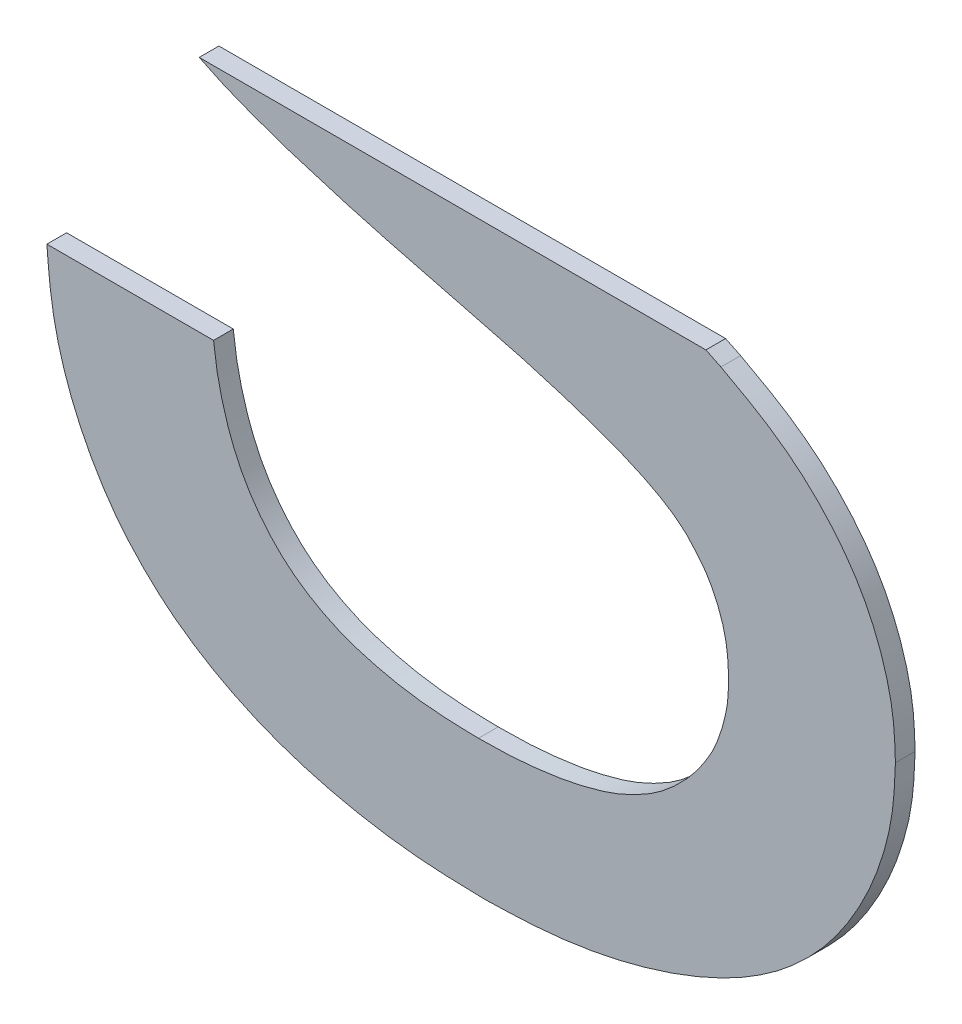
ISO-10303-21;
HEADER;
FILE_DESCRIPTION(('STEP AP214'),'2;1');
FILE_NAME('part.step','',(''),(''),'','','');
FILE_SCHEMA(('AUTOMOTIVE_DESIGN { 1 0 10303 214 1 1 1 1 }'));
ENDSEC;
DATA;
#1=APPLICATION_CONTEXT('core data for automotive mechanical design processes');
#2=APPLICATION_PROTOCOL_DEFINITION('international standard','automotive_design',2000,#1);
#3=PRODUCT_CONTEXT('',#1,'mechanical');
#4=PRODUCT('Part','Part','',(#3));
#5=PRODUCT_RELATED_PRODUCT_CATEGORY('part','',(#4));
#6=PRODUCT_DEFINITION_FORMATION('','',#4);
#7=PRODUCT_DEFINITION_CONTEXT('part definition',#1,'design');
#8=PRODUCT_DEFINITION('design','',#6,#7);
#9=PRODUCT_DEFINITION_SHAPE('','',#8);
#10=(LENGTH_UNIT() NAMED_UNIT(*) SI_UNIT(.MILLI.,.METRE.));
#11=(NAMED_UNIT(*) PLANE_ANGLE_UNIT() SI_UNIT($,.RADIAN.));
#12=(NAMED_UNIT(*) SI_UNIT($,.STERADIAN.) SOLID_ANGLE_UNIT());
#13=UNCERTAINTY_MEASURE_WITH_UNIT(LENGTH_MEASURE(1.E-05),#10,'distance_accuracy_value','');
#14=(GEOMETRIC_REPRESENTATION_CONTEXT(3) GLOBAL_UNCERTAINTY_ASSIGNED_CONTEXT((#13)) GLOBAL_UNIT_ASSIGNED_CONTEXT((#10,
#11,#12)) REPRESENTATION_CONTEXT('',''));
#15=CARTESIAN_POINT('',(0.,0.,0.));
#16=DIRECTION('',(0.,0.,1.));
#17=DIRECTION('',(1.,0.,0.));
#18=AXIS2_PLACEMENT_3D('',#15,#16,#17);
#19=CARTESIAN_POINT('',(5.46274038461435,-4.79567307692308,0.5));
#20=CARTESIAN_POINT('',(5.35855534775969,-4.70687353213871,0.5));
#21=CARTESIAN_POINT('',(5.12815657132435,-4.51049882148931,0.5));
#22=CARTESIAN_POINT('',(4.69946402907004,-4.25062026916394,0.5));
#23=CARTESIAN_POINT('',(4.16794938090392,-3.98804411029912,0.5));
#24=CARTESIAN_POINT('',(3.530058232044,-3.72703254015637,0.5));
#25=CARTESIAN_POINT('',(2.78690143860023,-3.46436404531144,0.5));
#26=CARTESIAN_POINT('',(1.93961750352461,-3.19411045590582,0.5));
#27=CARTESIAN_POINT('',(0.98337756459319,-2.92431205706373,0.5));
#28=CARTESIAN_POINT('',(-0.0501527574609852,-2.66853448428978,0.5));
#29=CARTESIAN_POINT('',(-1.09279838034203,-2.40591015089581,0.5));
#30=CARTESIAN_POINT('',(-2.08228100184151,-2.14713457683062,0.5));
#31=CARTESIAN_POINT('',(-2.99429833585646,-1.90530419286865,0.5));
#32=CARTESIAN_POINT('',(-3.81834933325007,-1.65353748972119,0.5));
#33=CARTESIAN_POINT('',(-4.56799356563629,-1.43270284207744,0.5));
#34=CARTESIAN_POINT('',(-5.22837105690996,-1.19953555628057,0.5));
#35=CARTESIAN_POINT('',(-5.81134590562884,-0.987938974377531,0.5));
#36=CARTESIAN_POINT('',(-6.16835592120979,-0.838584142741154,0.5));
#37=CARTESIAN_POINT('',(-6.33413461538565,-0.76923076923077,0.5));
#38=B_SPLINE_CURVE_WITH_KNOTS('',3,(#19,#20,#21,#22,#23,#24,#25,#26,#27,#28,#29,#30,#31,#32,#33,
#34,#35,#36,#37),.UNSPECIFIED.,.F.,.F.,(4,1,1,1,1,1,1,1,1,1,1,1,1,1,1,1,4),(0.,
0.0327434629435831,0.0724101466603221,0.119612379731133,0.174674220648575,0.237346864036756,
0.308354721371247,0.387632944786603,0.475252052982896,0.563336209685837,0.645140721901864,
0.720207592816174,0.78927483829459,0.851495963706113,0.907329911849841,0.956968360739976,1.),.UNSPECIFIED.);
#39=DIRECTION('',(0.,0.,1.));
#40=VECTOR('',#39,1.);
#41=SURFACE_OF_LINEAR_EXTRUSION('',#38,#40);
#42=CARTESIAN_POINT('',(5.46274038461435,-4.79567307692308,1.));
#43=CARTESIAN_POINT('',(5.35855534775969,-4.70687353213871,1.));
#44=CARTESIAN_POINT('',(5.12815657132435,-4.51049882148931,1.));
#45=CARTESIAN_POINT('',(4.69946402907004,-4.25062026916394,1.));
#46=CARTESIAN_POINT('',(4.16794938090392,-3.98804411029912,1.));
#47=CARTESIAN_POINT('',(3.530058232044,-3.72703254015637,1.));
#48=CARTESIAN_POINT('',(2.78690143860023,-3.46436404531144,1.));
#49=CARTESIAN_POINT('',(1.93961750352461,-3.19411045590582,1.));
#50=CARTESIAN_POINT('',(0.98337756459319,-2.92431205706373,1.));
#51=CARTESIAN_POINT('',(-0.0501527574609852,-2.66853448428978,1.));
#52=CARTESIAN_POINT('',(-1.09279838034203,-2.40591015089581,1.));
#53=CARTESIAN_POINT('',(-2.08228100184151,-2.14713457683062,1.));
#54=CARTESIAN_POINT('',(-2.99429833585646,-1.90530419286865,1.));
#55=CARTESIAN_POINT('',(-3.81834933325007,-1.65353748972119,1.));
#56=CARTESIAN_POINT('',(-4.56799356563629,-1.43270284207744,1.));
#57=CARTESIAN_POINT('',(-5.22837105690996,-1.19953555628057,1.));
#58=CARTESIAN_POINT('',(-5.81134590562884,-0.987938974377531,1.));
#59=CARTESIAN_POINT('',(-6.16835592120979,-0.838584142741154,1.));
#60=CARTESIAN_POINT('',(-6.33413461538565,-0.76923076923077,1.));
#61=B_SPLINE_CURVE_WITH_KNOTS('',3,(#42,#43,#44,#45,#46,#47,#48,#49,#50,#51,#52,#53,#54,#55,#56,
#57,#58,#59,#60),.UNSPECIFIED.,.F.,.F.,(4,1,1,1,1,1,1,1,1,1,1,1,1,1,1,1,4),(0.,
0.0327434629435831,0.0724101466603221,0.119612379731133,0.174674220648575,0.237346864036756,
0.308354721371247,0.387632944786603,0.475252052982896,0.563336209685837,0.645140721901864,
0.720207592816174,0.78927483829459,0.851495963706113,0.907329911849841,0.956968360739976,1.),.UNSPECIFIED.);
#62=CARTESIAN_POINT('',(5.46274038461435,-4.79567307692308,1.));
#63=VERTEX_POINT('',#62);
#64=CARTESIAN_POINT('',(-6.33413461538565,-0.76923076923077,1.));
#65=VERTEX_POINT('',#64);
#66=EDGE_CURVE('E102',#63,#65,#61,.T.);
#67=ORIENTED_EDGE('',*,*,#66,.T.);
#68=DIRECTION('',(0.,0.,1.));
#69=VECTOR('',#68,1.);
#70=CARTESIAN_POINT('',(-6.33413461538565,-0.76923076923077,0.5));
#71=LINE('',#70,#69);
#72=CARTESIAN_POINT('',(-6.33413461538565,-0.76923076923077,0.5));
#73=VERTEX_POINT('',#72);
#74=EDGE_CURVE('E319',#73,#65,#71,.T.);
#75=ORIENTED_EDGE('',*,*,#74,.F.);
#76=CARTESIAN_POINT('',(5.46274038461435,-4.79567307692308,0.5));
#77=VERTEX_POINT('',#76);
#78=EDGE_CURVE('E63',#77,#73,#38,.T.);
#79=ORIENTED_EDGE('',*,*,#78,.F.);
#80=DIRECTION('',(0.,0.,1.));
#81=VECTOR('',#80,1.);
#82=CARTESIAN_POINT('',(5.46274038461435,-4.79567307692308,0.5));
#83=LINE('',#82,#81);
#84=EDGE_CURVE('E150',#77,#63,#83,.T.);
#85=ORIENTED_EDGE('',*,*,#84,.T.);
#86=EDGE_LOOP('',(#67,#75,#79,#85));
#87=FACE_BOUND('',#86,.T.);
#88=ADVANCED_FACE('F39',(#87),#41,.F.);
#89=CARTESIAN_POINT('',(6.53846153846051,-7.44591346153846,0.5));
#90=CARTESIAN_POINT('',(6.52752823491745,-7.18780664806593,0.5));
#91=CARTESIAN_POINT('',(6.50630770082304,-6.68684512132103,0.5));
#92=CARTESIAN_POINT('',(6.28961502145924,-5.97512980245527,0.5));
#93=CARTESIAN_POINT('',(5.95634016450596,-5.32635517481283,0.5));
#94=CARTESIAN_POINT('',(5.62801132865093,-4.97336021308997,0.5));
#95=CARTESIAN_POINT('',(5.46274038461435,-4.79567307692308,0.5));
#96=B_SPLINE_CURVE_WITH_KNOTS('',3,(#89,#90,#91,#92,#93,#94,#95),.UNSPECIFIED.,.F.,.F.,(4,1,1,1,
4),(0.,0.262741230528268,0.509956502943233,0.75332671842045,1.),.UNSPECIFIED.);
#97=DIRECTION('',(0.,0.,1.));
#98=VECTOR('',#97,1.);
#99=SURFACE_OF_LINEAR_EXTRUSION('',#96,#98);
#100=CARTESIAN_POINT('',(6.53846153846051,-7.44591346153846,1.));
#101=CARTESIAN_POINT('',(6.52752823491745,-7.18780664806593,1.));
#102=CARTESIAN_POINT('',(6.50630770082304,-6.68684512132103,1.));
#103=CARTESIAN_POINT('',(6.28961502145924,-5.97512980245527,1.));
#104=CARTESIAN_POINT('',(5.95634016450596,-5.32635517481283,1.));
#105=CARTESIAN_POINT('',(5.62801132865093,-4.97336021308997,1.));
#106=CARTESIAN_POINT('',(5.46274038461435,-4.79567307692308,1.));
#107=B_SPLINE_CURVE_WITH_KNOTS('',3,(#100,#101,#102,#103,#104,#105,#106),.UNSPECIFIED.,.F.,.F.,
(4,1,1,1,4),(0.,0.262741230528268,0.509956502943233,0.75332671842045,1.),.UNSPECIFIED.);
#108=CARTESIAN_POINT('',(6.53846153846051,-7.44591346153846,1.));
#109=VERTEX_POINT('',#108);
#110=EDGE_CURVE('E298',#109,#63,#107,.T.);
#111=ORIENTED_EDGE('',*,*,#110,.T.);
#112=ORIENTED_EDGE('',*,*,#84,.F.);
#113=CARTESIAN_POINT('',(6.53846153846051,-7.44591346153846,0.5));
#114=VERTEX_POINT('',#113);
#115=EDGE_CURVE('E131',#114,#77,#96,.T.);
#116=ORIENTED_EDGE('',*,*,#115,.F.);
#117=DIRECTION('',(0.,0.,1.));
#118=VECTOR('',#117,1.);
#119=CARTESIAN_POINT('',(6.53846153846051,-7.44591346153846,0.5));
#120=LINE('',#119,#118);
#121=EDGE_CURVE('E139',#114,#109,#120,.T.);
#122=ORIENTED_EDGE('',*,*,#121,.T.);
#123=EDGE_LOOP('',(#111,#112,#116,#122));
#124=FACE_BOUND('',#123,.T.);
#125=ADVANCED_FACE('F146',(#124),#99,.F.);
#126=CARTESIAN_POINT('',(0.186298076922045,-11.9230769230769,0.5));
#127=CARTESIAN_POINT('',(0.452917518044397,-11.9210937635696,0.5));
#128=CARTESIAN_POINT('',(0.96902718427602,-11.9172548544973,0.5));
#129=CARTESIAN_POINT('',(1.71496689021582,-11.8459872335629,0.5));
#130=CARTESIAN_POINT('',(2.40691638472193,-11.7499167269663,0.5));
#131=CARTESIAN_POINT('',(3.04061013232792,-11.6024449932228,0.5));
#132=CARTESIAN_POINT('',(3.62196142670062,-11.4289410917482,0.5));
#133=CARTESIAN_POINT('',(4.14077313905586,-11.1959576905632,0.5));
#134=CARTESIAN_POINT('',(4.60941073522477,-10.9333231819877,0.5));
#135=CARTESIAN_POINT('',(5.01932751021528,-10.6254712040485,0.5));
#136=CARTESIAN_POINT('',(5.37264405381542,-10.2841727290803,0.5));
#137=CARTESIAN_POINT('',(5.68975027577586,-9.93358291449948,0.5));
#138=CARTESIAN_POINT('',(5.94543653971101,-9.55536049090254,0.5));
#139=CARTESIAN_POINT('',(6.1705814595386,-9.17044860815597,0.5));
#140=CARTESIAN_POINT('',(6.32745297205423,-8.75837554958169,0.5));
#141=CARTESIAN_POINT('',(6.45059355615463,-8.3370693226526,0.5));
#142=CARTESIAN_POINT('',(6.52546978829639,-7.89727149237541,0.5));
#143=CARTESIAN_POINT('',(6.53407111165592,-7.59844521222789,0.5));
#144=CARTESIAN_POINT('',(6.53846153846051,-7.44591346153846,0.5));
#145=B_SPLINE_CURVE_WITH_KNOTS('',3,(#126,#127,#128,#129,#130,#131,#132,#133,#134,#135,#136,
#137,#138,#139,#140,#141,#142,#143,#144),.UNSPECIFIED.,.F.,.F.,(4,1,1,1,1,1,1,1,1,1,1,1,1,1,1,1,
4),(0.,0.0915140484692245,0.177148691078688,0.257116948109752,0.331209300984302,
0.400397190524263,0.465074479187229,0.526080828418267,0.584552377371531,0.64050961155947,
0.694609394798849,0.7465128494333,0.797025553133285,0.847355247690185,0.89743516554621,
0.947647195719586,1.),.UNSPECIFIED.);
#146=DIRECTION('',(0.,0.,1.));
#147=VECTOR('',#146,1.);
#148=SURFACE_OF_LINEAR_EXTRUSION('',#145,#147);
#149=CARTESIAN_POINT('',(0.186298076922045,-11.9230769230769,1.));
#150=CARTESIAN_POINT('',(0.452917518044397,-11.9210937635696,1.));
#151=CARTESIAN_POINT('',(0.96902718427602,-11.9172548544973,1.));
#152=CARTESIAN_POINT('',(1.71496689021582,-11.8459872335629,1.));
#153=CARTESIAN_POINT('',(2.40691638472193,-11.7499167269663,1.));
#154=CARTESIAN_POINT('',(3.04061013232792,-11.6024449932228,1.));
#155=CARTESIAN_POINT('',(3.62196142670062,-11.4289410917482,1.));
#156=CARTESIAN_POINT('',(4.14077313905586,-11.1959576905632,1.));
#157=CARTESIAN_POINT('',(4.60941073522477,-10.9333231819877,1.));
#158=CARTESIAN_POINT('',(5.01932751021528,-10.6254712040485,1.));
#159=CARTESIAN_POINT('',(5.37264405381542,-10.2841727290803,1.));
#160=CARTESIAN_POINT('',(5.68975027577586,-9.93358291449948,1.));
#161=CARTESIAN_POINT('',(5.94543653971101,-9.55536049090254,1.));
#162=CARTESIAN_POINT('',(6.1705814595386,-9.17044860815597,1.));
#163=CARTESIAN_POINT('',(6.32745297205423,-8.75837554958169,1.));
#164=CARTESIAN_POINT('',(6.45059355615463,-8.3370693226526,1.));
#165=CARTESIAN_POINT('',(6.52546978829639,-7.89727149237541,1.));
#166=CARTESIAN_POINT('',(6.53407111165592,-7.59844521222789,1.));
#167=CARTESIAN_POINT('',(6.53846153846051,-7.44591346153846,1.));
#168=B_SPLINE_CURVE_WITH_KNOTS('',3,(#149,#150,#151,#152,#153,#154,#155,#156,#157,#158,#159,
#160,#161,#162,#163,#164,#165,#166,#167),.UNSPECIFIED.,.F.,.F.,(4,1,1,1,1,1,1,1,1,1,1,1,1,1,1,1,
4),(0.,0.0915140484692245,0.177148691078688,0.257116948109752,0.331209300984302,
0.400397190524263,0.465074479187229,0.526080828418267,0.584552377371531,0.64050961155947,
0.694609394798849,0.7465128494333,0.797025553133285,0.847355247690185,0.89743516554621,
0.947647195719586,1.),.UNSPECIFIED.);
#169=CARTESIAN_POINT('',(0.186298076922045,-11.9230769230769,1.));
#170=VERTEX_POINT('',#169);
#171=EDGE_CURVE('E142',#170,#109,#168,.T.);
#172=ORIENTED_EDGE('',*,*,#171,.T.);
#173=ORIENTED_EDGE('',*,*,#121,.F.);
#174=CARTESIAN_POINT('',(0.186298076922045,-11.9230769230769,0.5));
#175=VERTEX_POINT('',#174);
#176=EDGE_CURVE('E130',#175,#114,#145,.T.);
#177=ORIENTED_EDGE('',*,*,#176,.F.);
#178=DIRECTION('',(0.,0.,1.));
#179=VECTOR('',#178,1.);
#180=CARTESIAN_POINT('',(0.186298076922045,-11.9230769230769,0.5));
#181=LINE('',#180,#179);
#182=EDGE_CURVE('E147',#175,#170,#181,.T.);
#183=ORIENTED_EDGE('',*,*,#182,.T.);
#184=EDGE_LOOP('',(#172,#173,#177,#183));
#185=FACE_BOUND('',#184,.T.);
#186=ADVANCED_FACE('F141',(#185),#148,.F.);
#187=CARTESIAN_POINT('',(-6.53846153846257,-6.53846153846154,0.5));
#188=CARTESIAN_POINT('',(-6.51246258210713,-6.75349524100316,0.5));
#189=CARTESIAN_POINT('',(-6.46153800794992,-7.17468521423413,0.5));
#190=CARTESIAN_POINT('',(-6.3186754851747,-7.78000871491224,0.5));
#191=CARTESIAN_POINT('',(-6.14779119895138,-8.3485743947791,0.5));
#192=CARTESIAN_POINT('',(-5.93049214281791,-8.87399210906799,0.5));
#193=CARTESIAN_POINT('',(-5.67115183840622,-9.36090794848327,0.5));
#194=CARTESIAN_POINT('',(-5.36353125095178,-9.80376839325495,0.5));
#195=CARTESIAN_POINT('',(-5.01980561076393,-10.210955042207,0.5));
#196=CARTESIAN_POINT('',(-4.63168208872818,-10.5753219940976,0.5));
#197=CARTESIAN_POINT('',(-4.19548861918931,-10.8953113414413,0.5));
#198=CARTESIAN_POINT('',(-3.71113385038324,-11.1718621140596,0.5));
#199=CARTESIAN_POINT('',(-3.18041362236934,-11.4082303374483,0.5));
#200=CARTESIAN_POINT('',(-2.59817995810646,-11.5904515860155,0.5));
#201=CARTESIAN_POINT('',(-1.97221800331249,-11.7417718421085,0.5));
#202=CARTESIAN_POINT('',(-1.29532617326138,-11.8503932876669,0.5));
#203=CARTESIAN_POINT('',(-0.569870826836896,-11.9066618643388,0.5));
#204=CARTESIAN_POINT('',(-0.0701979570147258,-11.9175088582673,0.5));
#205=CARTESIAN_POINT('',(0.186298076922045,-11.9230769230769,0.5));
#206=B_SPLINE_CURVE_WITH_KNOTS('',3,(#187,#188,#189,#190,#191,#192,#193,#194,#195,#196,#197,
#198,#199,#200,#201,#202,#203,#204,#205),.UNSPECIFIED.,.F.,.F.,(4,1,1,1,1,1,1,1,1,1,1,1,1,1,1,1,
4),(0.,0.0671410498282914,0.131510254651379,0.192639446417471,0.251147769802786,
0.307586721038773,0.363434168034989,0.418097065205676,0.47261141200912,0.528167696051712,
0.585512769002848,0.645326514018987,0.708015056196522,0.774482698796732,0.844973721145099,
0.920420683043269,1.),.UNSPECIFIED.);
#207=DIRECTION('',(0.,0.,1.));
#208=VECTOR('',#207,1.);
#209=SURFACE_OF_LINEAR_EXTRUSION('',#206,#208);
#210=CARTESIAN_POINT('',(-6.53846153846257,-6.53846153846154,1.));
#211=CARTESIAN_POINT('',(-6.51246258210713,-6.75349524100316,1.));
#212=CARTESIAN_POINT('',(-6.46153800794992,-7.17468521423413,1.));
#213=CARTESIAN_POINT('',(-6.3186754851747,-7.78000871491224,1.));
#214=CARTESIAN_POINT('',(-6.14779119895138,-8.3485743947791,1.));
#215=CARTESIAN_POINT('',(-5.93049214281791,-8.87399210906799,1.));
#216=CARTESIAN_POINT('',(-5.67115183840622,-9.36090794848327,1.));
#217=CARTESIAN_POINT('',(-5.36353125095178,-9.80376839325495,1.));
#218=CARTESIAN_POINT('',(-5.01980561076393,-10.210955042207,1.));
#219=CARTESIAN_POINT('',(-4.63168208872818,-10.5753219940976,1.));
#220=CARTESIAN_POINT('',(-4.19548861918931,-10.8953113414413,1.));
#221=CARTESIAN_POINT('',(-3.71113385038324,-11.1718621140596,1.));
#222=CARTESIAN_POINT('',(-3.18041362236934,-11.4082303374483,1.));
#223=CARTESIAN_POINT('',(-2.59817995810646,-11.5904515860155,1.));
#224=CARTESIAN_POINT('',(-1.97221800331249,-11.7417718421085,1.));
#225=CARTESIAN_POINT('',(-1.29532617326138,-11.8503932876669,1.));
#226=CARTESIAN_POINT('',(-0.569870826836896,-11.9066618643388,1.));
#227=CARTESIAN_POINT('',(-0.0701979570147258,-11.9175088582673,1.));
#228=CARTESIAN_POINT('',(0.186298076922045,-11.9230769230769,1.));
#229=B_SPLINE_CURVE_WITH_KNOTS('',3,(#210,#211,#212,#213,#214,#215,#216,#217,#218,#219,#220,
#221,#222,#223,#224,#225,#226,#227,#228),.UNSPECIFIED.,.F.,.F.,(4,1,1,1,1,1,1,1,1,1,1,1,1,1,1,1,
4),(0.,0.0671410498282914,0.131510254651379,0.192639446417471,0.251147769802786,
0.307586721038773,0.363434168034989,0.418097065205676,0.47261141200912,0.528167696051712,
0.585512769002848,0.645326514018987,0.708015056196522,0.774482698796732,0.844973721145099,
0.920420683043269,1.),.UNSPECIFIED.);
#230=CARTESIAN_POINT('',(-6.53846153846257,-6.53846153846154,1.));
#231=VERTEX_POINT('',#230);
#232=EDGE_CURVE('E270',#231,#170,#229,.T.);
#233=ORIENTED_EDGE('',*,*,#232,.T.);
#234=ORIENTED_EDGE('',*,*,#182,.F.);
#235=CARTESIAN_POINT('',(-6.53846153846257,-6.53846153846154,0.5));
#236=VERTEX_POINT('',#235);
#237=EDGE_CURVE('E132',#236,#175,#206,.T.);
#238=ORIENTED_EDGE('',*,*,#237,.F.);
#239=DIRECTION('',(0.,0.,1.));
#240=VECTOR('',#239,1.);
#241=CARTESIAN_POINT('',(-6.53846153846257,-6.53846153846154,0.5));
#242=LINE('',#241,#240);
#243=EDGE_CURVE('E259',#236,#231,#242,.T.);
#244=ORIENTED_EDGE('',*,*,#243,.T.);
#245=EDGE_LOOP('',(#233,#234,#238,#244));
#246=FACE_BOUND('',#245,.T.);
#247=ADVANCED_FACE('F174',(#246),#209,.F.);
#248=CARTESIAN_POINT('',(-10.7692307692318,-6.53846153846154,0.5));
#249=DIRECTION('',(0.,-1.,0.));
#250=DIRECTION('',(0.,0.,-1.));
#251=AXIS2_PLACEMENT_3D('',#248,#249,#250);
#252=PLANE('',#251);
#253=DIRECTION('',(1.,0.,0.));
#254=VECTOR('',#253,1.);
#255=CARTESIAN_POINT('',(-10.7692307692318,-6.53846153846154,1.));
#256=LINE('',#255,#254);
#257=CARTESIAN_POINT('',(-10.7692307692318,-6.53846153846154,1.));
#258=VERTEX_POINT('',#257);
#259=EDGE_CURVE('E264',#258,#231,#256,.T.);
#260=ORIENTED_EDGE('',*,*,#259,.T.);
#261=ORIENTED_EDGE('',*,*,#243,.F.);
#262=DIRECTION('',(1.,0.,0.));
#263=VECTOR('',#262,1.);
#264=CARTESIAN_POINT('',(-10.7692307692318,-6.53846153846154,0.5));
#265=LINE('',#264,#263);
#266=CARTESIAN_POINT('',(-10.7692307692318,-6.53846153846154,0.5));
#267=VERTEX_POINT('',#266);
#268=EDGE_CURVE('E182',#267,#236,#265,.T.);
#269=ORIENTED_EDGE('',*,*,#268,.F.);
#270=DIRECTION('',(0.,0.,1.));
#271=VECTOR('',#270,1.);
#272=CARTESIAN_POINT('',(-10.7692307692318,-6.53846153846154,0.5));
#273=LINE('',#272,#271);
#274=EDGE_CURVE('E255',#267,#258,#273,.T.);
#275=ORIENTED_EDGE('',*,*,#274,.T.);
#276=EDGE_LOOP('',(#260,#261,#269,#275));
#277=FACE_BOUND('',#276,.T.);
#278=ADVANCED_FACE('F180',(#277),#252,.F.);
#279=CARTESIAN_POINT('',(0.354567307691275,-15.3846153846154,0.5));
#280=CARTESIAN_POINT('',(-0.178942044865557,-15.3727765981755,0.5));
#281=CARTESIAN_POINT('',(-1.21580089256134,-15.3497682846243,0.5));
#282=CARTESIAN_POINT('',(-2.72346584102555,-15.1468552978563,0.5));
#283=CARTESIAN_POINT('',(-4.13386532433598,-14.8198901658255,0.5));
#284=CARTESIAN_POINT('',(-5.23793163899655,-14.434677554152,0.5));
#285=CARTESIAN_POINT('',(-6.05631632670591,-14.0517808828222,0.5));
#286=CARTESIAN_POINT('',(-6.6331715895008,-13.7432313382683,0.5));
#287=CARTESIAN_POINT('',(-7.170447761062,-13.3954930679985,0.5));
#288=CARTESIAN_POINT('',(-7.67839748402824,-13.0273028121518,0.5));
#289=CARTESIAN_POINT('',(-8.13886767785444,-12.6146772062179,0.5));
#290=CARTESIAN_POINT('',(-8.57087624250783,-12.1793168948725,0.5));
#291=CARTESIAN_POINT('',(-8.96715537340657,-11.7128294898175,0.5));
#292=CARTESIAN_POINT('',(-9.43774817450531,-11.0465687969175,0.5));
#293=CARTESIAN_POINT('',(-9.93483279384182,-10.15553800032,0.5));
#294=CARTESIAN_POINT('',(-10.3837441578237,-9.01269456311259,0.5));
#295=CARTESIAN_POINT('',(-10.6712102632264,-7.79754971424661,0.5));
#296=CARTESIAN_POINT('',(-10.7362098734034,-6.96261992312734,0.5));
#297=CARTESIAN_POINT('',(-10.7692307692318,-6.53846153846154,0.5));
#298=B_SPLINE_CURVE_WITH_KNOTS('',3,(#279,#280,#281,#282,#283,#284,#285,#286,#287,#288,#289,
#290,#291,#292,#293,#294,#295,#296,#297),.UNSPECIFIED.,.F.,.F.,(4,1,1,1,1,1,1,1,1,1,1,1,1,1,1,1,
4),(0.,0.100465731843337,0.195252027828133,0.28596258105455,0.372854013961896,0.414892898071038,
0.456093486286028,0.49597685883874,0.535375254535376,0.574141456837756,0.61230045350557,
0.650858545757538,0.689287154964181,0.765819433510267,0.842414021515933,0.919943670964025,1.),.UNSPECIFIED.);
#299=DIRECTION('',(0.,0.,1.));
#300=VECTOR('',#299,1.);
#301=SURFACE_OF_LINEAR_EXTRUSION('',#298,#300);
#302=CARTESIAN_POINT('',(0.354567307691275,-15.3846153846154,1.));
#303=CARTESIAN_POINT('',(-0.178942044865557,-15.3727765981755,1.));
#304=CARTESIAN_POINT('',(-1.21580089256134,-15.3497682846243,1.));
#305=CARTESIAN_POINT('',(-2.72346584102555,-15.1468552978563,1.));
#306=CARTESIAN_POINT('',(-4.13386532433598,-14.8198901658255,1.));
#307=CARTESIAN_POINT('',(-5.23793163899655,-14.434677554152,1.));
#308=CARTESIAN_POINT('',(-6.05631632670591,-14.0517808828222,1.));
#309=CARTESIAN_POINT('',(-6.6331715895008,-13.7432313382683,1.));
#310=CARTESIAN_POINT('',(-7.170447761062,-13.3954930679985,1.));
#311=CARTESIAN_POINT('',(-7.67839748402824,-13.0273028121518,1.));
#312=CARTESIAN_POINT('',(-8.13886767785444,-12.6146772062179,1.));
#313=CARTESIAN_POINT('',(-8.57087624250783,-12.1793168948725,1.));
#314=CARTESIAN_POINT('',(-8.96715537340657,-11.7128294898175,1.));
#315=CARTESIAN_POINT('',(-9.43774817450531,-11.0465687969175,1.));
#316=CARTESIAN_POINT('',(-9.93483279384182,-10.15553800032,1.));
#317=CARTESIAN_POINT('',(-10.3837441578237,-9.01269456311259,1.));
#318=CARTESIAN_POINT('',(-10.6712102632264,-7.79754971424661,1.));
#319=CARTESIAN_POINT('',(-10.7362098734034,-6.96261992312734,1.));
#320=CARTESIAN_POINT('',(-10.7692307692318,-6.53846153846154,1.));
#321=B_SPLINE_CURVE_WITH_KNOTS('',3,(#302,#303,#304,#305,#306,#307,#308,#309,#310,#311,#312,
#313,#314,#315,#316,#317,#318,#319,#320),.UNSPECIFIED.,.F.,.F.,(4,1,1,1,1,1,1,1,1,1,1,1,1,1,1,1,
4),(0.,0.100465731843337,0.195252027828133,0.28596258105455,0.372854013961896,0.414892898071038,
0.456093486286028,0.49597685883874,0.535375254535376,0.574141456837756,0.61230045350557,
0.650858545757538,0.689287154964181,0.765819433510267,0.842414021515933,0.919943670964025,1.),.UNSPECIFIED.);
#322=CARTESIAN_POINT('',(0.354567307691275,-15.3846153846154,1.));
#323=VERTEX_POINT('',#322);
#324=EDGE_CURVE('E257',#323,#258,#321,.T.);
#325=ORIENTED_EDGE('',*,*,#324,.T.);
#326=ORIENTED_EDGE('',*,*,#274,.F.);
#327=CARTESIAN_POINT('',(0.354567307691275,-15.3846153846154,0.5));
#328=VERTEX_POINT('',#327);
#329=EDGE_CURVE('E188',#328,#267,#298,.T.);
#330=ORIENTED_EDGE('',*,*,#329,.F.);
#331=DIRECTION('',(0.,0.,1.));
#332=VECTOR('',#331,1.);
#333=CARTESIAN_POINT('',(0.354567307691275,-15.3846153846154,0.5));
#334=LINE('',#333,#332);
#335=EDGE_CURVE('E249',#328,#323,#334,.T.);
#336=ORIENTED_EDGE('',*,*,#335,.T.);
#337=EDGE_LOOP('',(#325,#326,#330,#336));
#338=FACE_BOUND('',#337,.T.);
#339=ADVANCED_FACE('F205',(#338),#301,.F.);
#340=CARTESIAN_POINT('',(10.7692307692297,-7.16947115384616,0.5));
#341=CARTESIAN_POINT('',(10.7549717575307,-7.54140631258377,0.5));
#342=CARTESIAN_POINT('',(10.7266106867331,-8.28118264433013,0.5));
#343=CARTESIAN_POINT('',(10.4744039404402,-9.36654558948745,0.5));
#344=CARTESIAN_POINT('',(10.0727125796198,-10.4143576187511,0.5));
#345=CARTESIAN_POINT('',(9.60999788345119,-11.243651930228,0.5));
#346=CARTESIAN_POINT('',(9.16535474952128,-11.8733221708387,0.5));
#347=CARTESIAN_POINT('',(8.79165478312556,-12.3197998616599,0.5));
#348=CARTESIAN_POINT('',(8.3792910624717,-12.7350196915839,0.5));
#349=CARTESIAN_POINT('',(7.93728142813867,-13.1275966615625,0.5));
#350=CARTESIAN_POINT('',(7.44966664038594,-13.4828518088247,0.5));
#351=CARTESIAN_POINT('',(6.93105249967499,-13.8126681129987,0.5));
#352=CARTESIAN_POINT('',(6.3708153268057,-14.1082184571279,0.5));
#353=CARTESIAN_POINT('',(5.57763630836237,-14.468549260316,0.5));
#354=CARTESIAN_POINT('',(4.52264338435113,-14.837983240205,0.5));
#355=CARTESIAN_POINT('',(3.19431740171375,-15.1580574027142,0.5));
#356=CARTESIAN_POINT('',(1.79620056756058,-15.3454252949083,0.5));
#357=CARTESIAN_POINT('',(0.841908856679863,-15.3713672447767,0.5));
#358=CARTESIAN_POINT('',(0.354567307691275,-15.3846153846154,0.5));
#359=B_SPLINE_CURVE_WITH_KNOTS('',3,(#340,#341,#342,#343,#344,#345,#346,#347,#348,#349,#350,
#351,#352,#353,#354,#355,#356,#357,#358),.UNSPECIFIED.,.F.,.F.,(4,1,1,1,1,1,1,1,1,1,1,1,1,1,1,1,
4),(0.,0.0750035017521159,0.149181420714937,0.223688255785939,0.300994145424436,
0.340156802941575,0.37920024993524,0.418379609727377,0.458213108010076,0.498414458840207,
0.540040986108378,0.582196565434744,0.626176961290227,0.715844011288615,0.807363449218976,
0.901623587442878,1.),.UNSPECIFIED.);
#360=DIRECTION('',(0.,0.,1.));
#361=VECTOR('',#360,1.);
#362=SURFACE_OF_LINEAR_EXTRUSION('',#359,#361);
#363=CARTESIAN_POINT('',(10.7692307692297,-7.16947115384616,1.));
#364=CARTESIAN_POINT('',(10.7549717575307,-7.54140631258377,1.));
#365=CARTESIAN_POINT('',(10.7266106867331,-8.28118264433013,1.));
#366=CARTESIAN_POINT('',(10.4744039404402,-9.36654558948745,1.));
#367=CARTESIAN_POINT('',(10.0727125796198,-10.4143576187511,1.));
#368=CARTESIAN_POINT('',(9.60999788345119,-11.243651930228,1.));
#369=CARTESIAN_POINT('',(9.16535474952128,-11.8733221708387,1.));
#370=CARTESIAN_POINT('',(8.79165478312556,-12.3197998616599,1.));
#371=CARTESIAN_POINT('',(8.3792910624717,-12.7350196915839,1.));
#372=CARTESIAN_POINT('',(7.93728142813867,-13.1275966615625,1.));
#373=CARTESIAN_POINT('',(7.44966664038594,-13.4828518088247,1.));
#374=CARTESIAN_POINT('',(6.93105249967499,-13.8126681129987,1.));
#375=CARTESIAN_POINT('',(6.3708153268057,-14.1082184571279,1.));
#376=CARTESIAN_POINT('',(5.57763630836237,-14.468549260316,1.));
#377=CARTESIAN_POINT('',(4.52264338435113,-14.837983240205,1.));
#378=CARTESIAN_POINT('',(3.19431740171375,-15.1580574027142,1.));
#379=CARTESIAN_POINT('',(1.79620056756058,-15.3454252949083,1.));
#380=CARTESIAN_POINT('',(0.841908856679863,-15.3713672447767,1.));
#381=CARTESIAN_POINT('',(0.354567307691275,-15.3846153846154,1.));
#382=B_SPLINE_CURVE_WITH_KNOTS('',3,(#363,#364,#365,#366,#367,#368,#369,#370,#371,#372,#373,
#374,#375,#376,#377,#378,#379,#380,#381),.UNSPECIFIED.,.F.,.F.,(4,1,1,1,1,1,1,1,1,1,1,1,1,1,1,1,
4),(0.,0.0750035017521159,0.149181420714937,0.223688255785939,0.300994145424436,
0.340156802941575,0.37920024993524,0.418379609727377,0.458213108010076,0.498414458840207,
0.540040986108378,0.582196565434744,0.626176961290227,0.715844011288615,0.807363449218976,
0.901623587442878,1.),.UNSPECIFIED.);
#383=CARTESIAN_POINT('',(10.7692307692297,-7.16947115384616,1.));
#384=VERTEX_POINT('',#383);
#385=EDGE_CURVE('E252',#384,#323,#382,.T.);
#386=ORIENTED_EDGE('',*,*,#385,.T.);
#387=ORIENTED_EDGE('',*,*,#335,.F.);
#388=CARTESIAN_POINT('',(10.7692307692297,-7.16947115384616,0.5));
#389=VERTEX_POINT('',#388);
#390=EDGE_CURVE('E191',#389,#328,#359,.T.);
#391=ORIENTED_EDGE('',*,*,#390,.F.);
#392=DIRECTION('',(0.,0.,1.));
#393=VECTOR('',#392,1.);
#394=CARTESIAN_POINT('',(10.7692307692297,-7.16947115384616,0.5));
#395=LINE('',#394,#393);
#396=EDGE_CURVE('E242',#389,#384,#395,.T.);
#397=ORIENTED_EDGE('',*,*,#396,.T.);
#398=EDGE_LOOP('',(#386,#387,#391,#397));
#399=FACE_BOUND('',#398,.T.);
#400=ADVANCED_FACE('F203',(#399),#362,.F.);
#401=CARTESIAN_POINT('',(6.3401442307682,-0.685096153846156,0.5));
#402=CARTESIAN_POINT('',(6.69300913573357,-0.876074720345977,0.5));
#403=CARTESIAN_POINT('',(7.37413023594102,-1.2447130561509,0.5));
#404=CARTESIAN_POINT('',(8.29439432402831,-1.89992589845611,0.5));
#405=CARTESIAN_POINT('',(9.05678808873516,-2.64116170151088,0.5));
#406=CARTESIAN_POINT('',(9.68550790451791,-3.43980859393761,0.5));
#407=CARTESIAN_POINT('',(10.1709208286289,-4.30000547459713,0.5));
#408=CARTESIAN_POINT('',(10.5138745327299,-5.21233086662798,0.5));
#409=CARTESIAN_POINT('',(10.736599700283,-6.17322535592245,0.5));
#410=CARTESIAN_POINT('',(10.7582325736978,-6.83368975173156,0.5));
#411=CARTESIAN_POINT('',(10.7692307692297,-7.16947115384616,0.5));
#412=B_SPLINE_CURVE_WITH_KNOTS('',3,(#401,#402,#403,#404,#405,#406,#407,#408,#409,#410,#411),
.UNSPECIFIED.,.F.,.F.,(4,1,1,1,1,1,1,1,4),(0.,0.144869501422649,0.279635840252182,
0.40655363830618,0.527715001705223,0.645659068632734,0.761779742328719,0.878888350923188,1.),.UNSPECIFIED.);
#413=DIRECTION('',(0.,0.,1.));
#414=VECTOR('',#413,1.);
#415=SURFACE_OF_LINEAR_EXTRUSION('',#412,#414);
#416=CARTESIAN_POINT('',(6.3401442307682,-0.685096153846156,1.));
#417=CARTESIAN_POINT('',(6.69300913573357,-0.876074720345977,1.));
#418=CARTESIAN_POINT('',(7.37413023594102,-1.2447130561509,1.));
#419=CARTESIAN_POINT('',(8.29439432402831,-1.89992589845611,1.));
#420=CARTESIAN_POINT('',(9.05678808873516,-2.64116170151088,1.));
#421=CARTESIAN_POINT('',(9.68550790451791,-3.43980859393761,1.));
#422=CARTESIAN_POINT('',(10.1709208286289,-4.30000547459713,1.));
#423=CARTESIAN_POINT('',(10.5138745327299,-5.21233086662798,1.));
#424=CARTESIAN_POINT('',(10.736599700283,-6.17322535592245,1.));
#425=CARTESIAN_POINT('',(10.7582325736978,-6.83368975173156,1.));
#426=CARTESIAN_POINT('',(10.7692307692297,-7.16947115384616,1.));
#427=B_SPLINE_CURVE_WITH_KNOTS('',3,(#416,#417,#418,#419,#420,#421,#422,#423,#424,#425,#426),
.UNSPECIFIED.,.F.,.F.,(4,1,1,1,1,1,1,1,4),(0.,0.144869501422649,0.279635840252182,
0.40655363830618,0.527715001705223,0.645659068632734,0.761779742328719,0.878888350923188,1.),.UNSPECIFIED.);
#428=CARTESIAN_POINT('',(6.3401442307682,-0.685096153846156,1.));
#429=VERTEX_POINT('',#428);
#430=EDGE_CURVE('E275',#429,#384,#427,.T.);
#431=ORIENTED_EDGE('',*,*,#430,.T.);
#432=ORIENTED_EDGE('',*,*,#396,.F.);
#433=CARTESIAN_POINT('',(6.3401442307682,-0.685096153846156,0.5));
#434=VERTEX_POINT('',#433);
#435=EDGE_CURVE('E212',#434,#389,#412,.T.);
#436=ORIENTED_EDGE('',*,*,#435,.F.);
#437=DIRECTION('',(0.,0.,1.));
#438=VECTOR('',#437,1.);
#439=CARTESIAN_POINT('',(6.3401442307682,-0.685096153846156,0.5));
#440=LINE('',#439,#438);
#441=EDGE_CURVE('E42',#434,#429,#440,.T.);
#442=ORIENTED_EDGE('',*,*,#441,.T.);
#443=EDGE_LOOP('',(#431,#432,#436,#442));
#444=FACE_BOUND('',#443,.T.);
#445=ADVANCED_FACE('F210',(#444),#415,.F.);
#446=CARTESIAN_POINT('',(8.14305713410197,12.8301208020986,0.5));
#447=DIRECTION('',(0.,0.,1.));
#448=DIRECTION('',(0.,-1.,0.));
#449=AXIS2_PLACEMENT_3D('',#446,#447,#448);
#450=PLANE('',#449);
#451=CARTESIAN_POINT('',(-6.33413461538565,-0.76923076923077,0.5));
#452=CARTESIAN_POINT('',(-6.5498749101104,-0.6698349012352,0.5));
#453=CARTESIAN_POINT('',(-6.97333695426262,-0.474737469411492,0.5));
#454=CARTESIAN_POINT('',(-7.57252879000327,-0.140673929581437,0.5));
#455=CARTESIAN_POINT('',(-8.13527257558273,0.203254546695417,0.5));
#456=CARTESIAN_POINT('',(-8.64404485130501,0.5822454727118,0.5));
#457=CARTESIAN_POINT('',(-9.12384569204936,0.961743307487881,0.5));
#458=CARTESIAN_POINT('',(-9.55020307049364,1.37201275767485,0.5));
#459=CARTESIAN_POINT('',(-9.93228817813952,1.80340001840364,0.5));
#460=CARTESIAN_POINT('',(-10.3848849345285,2.39611039997635,0.5));
#461=CARTESIAN_POINT('',(-10.8491453548834,3.19611819473388,0.5));
#462=CARTESIAN_POINT('',(-11.2480287422924,4.23007263462684,0.5));
#463=CARTESIAN_POINT('',(-11.4975406108788,5.33476645352021,0.5));
#464=CARTESIAN_POINT('',(-11.52465243087,6.09643002795245,0.5));
#465=CARTESIAN_POINT('',(-11.5384615384626,6.484375,0.5));
#466=B_SPLINE_CURVE_WITH_KNOTS('',3,(#451,#452,#453,#454,#455,#456,#457,#458,#459,#460,#461,
#462,#463,#464,#465),.UNSPECIFIED.,.F.,.F.,(4,1,1,1,1,1,1,1,1,1,1,1,4),(0.,0.0749469658775914,
0.147108334184966,0.216409674186856,0.282932407800131,0.347217926398502,0.409378758984855,
0.469396312600535,0.528959181231001,0.644562709826563,0.759868442406739,0.877691629841046,1.),.UNSPECIFIED.);
#467=CARTESIAN_POINT('',(-6.90317594075877,-0.5,0.499999999999884));
#468=VERTEX_POINT('',#467);
#469=EDGE_CURVE('E152',#73,#468,#466,.T.);
#470=ORIENTED_EDGE('',*,*,#469,.T.);
#471=DIRECTION('',(1.,0.,0.));
#472=VECTOR('',#471,1.);
#473=CARTESIAN_POINT('',(8.14305713410197,-0.5,0.499999999999886));
#474=LINE('',#473,#472);
#475=CARTESIAN_POINT('',(5.95834375858965,-0.500000009710533,0.5));
#476=VERTEX_POINT('',#475);
#477=EDGE_CURVE('E235',#468,#476,#474,.T.);
#478=ORIENTED_EDGE('',*,*,#477,.T.);
#479=CARTESIAN_POINT('',(-4.11057692307796,2.63822115384615,0.5));
#480=CARTESIAN_POINT('',(-4.00488563491407,2.59484832968436,0.5));
#481=CARTESIAN_POINT('',(-3.76610981470908,2.49686124064652,0.5));
#482=CARTESIAN_POINT('',(-3.3568552795001,2.36715662740571,0.5));
#483=CARTESIAN_POINT('',(-2.87124370624326,2.19936163482353,0.5));
#484=CARTESIAN_POINT('',(-2.29933905732761,2.0274498742162,0.5));
#485=CARTESIAN_POINT('',(-1.64054876163591,1.84325418191542,0.5));
#486=CARTESIAN_POINT('',(-0.900915829957314,1.63127439359579,0.5));
#487=CARTESIAN_POINT('',(-0.0745724746311566,1.41053081331134,0.5));
#488=CARTESIAN_POINT('',(0.809542130682197,1.17684129858742,0.5));
#489=CARTESIAN_POINT('',(1.7044632703827,0.939812681982955,0.5));
#490=CARTESIAN_POINT('',(2.55933319638806,0.697455477380347,0.5));
#491=CARTESIAN_POINT('',(3.35070510887217,0.467590704325734,0.5));
#492=CARTESIAN_POINT('',(4.07556666863634,0.231341690606482,0.5));
#493=CARTESIAN_POINT('',(4.73461203592048,-0.00182823693737408,0.5));
#494=CARTESIAN_POINT('',(5.32964173384208,-0.230412348593633,0.5));
#495=CARTESIAN_POINT('',(5.86171425100032,-0.448722393173918,0.5));
#496=CARTESIAN_POINT('',(6.18667594071787,-0.609273403606436,0.5));
#497=CARTESIAN_POINT('',(6.3401442307682,-0.685096153846156,0.5));
#498=B_SPLINE_CURVE_WITH_KNOTS('',3,(#479,#480,#481,#482,#483,#484,#485,#486,#487,#488,#489,
#490,#491,#492,#493,#494,#495,#496,#497),.UNSPECIFIED.,.F.,.F.,(4,1,1,1,1,1,1,1,1,1,1,1,1,1,1,1,
4),(0.,0.0312005486837909,0.0704877074756246,0.117216473764155,0.171577933057924,
0.233598664496505,0.304114665578319,0.381780268712742,0.467272049488307,0.553962424494241,
0.634702640990441,0.710032621623598,0.779089305911882,0.842963443203923,0.900999818556514,
0.953245600815253,1.),.UNSPECIFIED.);
#499=EDGE_CURVE('E110',#476,#434,#498,.T.);
#500=ORIENTED_EDGE('',*,*,#499,.T.);
#501=ORIENTED_EDGE('',*,*,#435,.T.);
#502=ORIENTED_EDGE('',*,*,#390,.T.);
#503=ORIENTED_EDGE('',*,*,#329,.T.);
#504=ORIENTED_EDGE('',*,*,#268,.T.);
#505=ORIENTED_EDGE('',*,*,#237,.T.);
#506=ORIENTED_EDGE('',*,*,#176,.T.);
#507=ORIENTED_EDGE('',*,*,#115,.T.);
#508=ORIENTED_EDGE('',*,*,#78,.T.);
#509=EDGE_LOOP('',(#470,#478,#500,#501,#502,#503,#504,#505,#506,#507,#508));
#510=FACE_BOUND('',#509,.T.);
#511=ADVANCED_FACE('F129',(#510),#450,.F.);
#512=DIRECTION('',(0.,0.,1.));
#513=VECTOR('',#512,1.);
#514=SURFACE_OF_LINEAR_EXTRUSION('',#466,#513);
#515=CARTESIAN_POINT('',(-6.33413461538565,-0.76923076923077,1.));
#516=CARTESIAN_POINT('',(-6.5498749101104,-0.6698349012352,1.));
#517=CARTESIAN_POINT('',(-6.97333695426262,-0.474737469411492,1.));
#518=CARTESIAN_POINT('',(-7.57252879000327,-0.140673929581437,1.));
#519=CARTESIAN_POINT('',(-8.13527257558273,0.203254546695417,1.));
#520=CARTESIAN_POINT('',(-8.64404485130501,0.5822454727118,1.));
#521=CARTESIAN_POINT('',(-9.12384569204936,0.961743307487881,1.));
#522=CARTESIAN_POINT('',(-9.55020307049364,1.37201275767485,1.));
#523=CARTESIAN_POINT('',(-9.93228817813952,1.80340001840364,1.));
#524=CARTESIAN_POINT('',(-10.3848849345285,2.39611039997635,1.));
#525=CARTESIAN_POINT('',(-10.8491453548834,3.19611819473388,1.));
#526=CARTESIAN_POINT('',(-11.2480287422924,4.23007263462684,1.));
#527=CARTESIAN_POINT('',(-11.4975406108788,5.33476645352021,1.));
#528=CARTESIAN_POINT('',(-11.52465243087,6.09643002795245,1.));
#529=CARTESIAN_POINT('',(-11.5384615384626,6.484375,1.));
#530=B_SPLINE_CURVE_WITH_KNOTS('',3,(#515,#516,#517,#518,#519,#520,#521,#522,#523,#524,#525,
#526,#527,#528,#529),.UNSPECIFIED.,.F.,.F.,(4,1,1,1,1,1,1,1,1,1,1,1,4),(0.,0.0749469658775914,
0.147108334184966,0.216409674186856,0.282932407800131,0.347217926398502,0.409378758984855,
0.469396312600535,0.528959181231001,0.644562709826563,0.759868442406739,0.877691629841046,1.),.UNSPECIFIED.);
#531=CARTESIAN_POINT('',(-6.90317594075877,-0.5,1.));
#532=VERTEX_POINT('',#531);
#533=EDGE_CURVE('E223',#65,#532,#530,.T.);
#534=ORIENTED_EDGE('',*,*,#533,.T.);
#535=DIRECTION('',(0.,0.,1.));
#536=VECTOR('',#535,1.);
#537=CARTESIAN_POINT('',(-6.90317592133591,-0.5,0.5));
#538=LINE('',#537,#536);
#539=EDGE_CURVE('E227',#532,#468,#538,.F.);
#540=ORIENTED_EDGE('',*,*,#539,.T.);
#541=ORIENTED_EDGE('',*,*,#469,.F.);
#542=ORIENTED_EDGE('',*,*,#74,.T.);
#543=EDGE_LOOP('',(#534,#540,#541,#542));
#544=FACE_BOUND('',#543,.T.);
#545=ADVANCED_FACE('F330',(#544),#514,.F.);
#546=DIRECTION('',(0.,0.,1.));
#547=VECTOR('',#546,1.);
#548=SURFACE_OF_LINEAR_EXTRUSION('',#498,#547);
#549=ORIENTED_EDGE('',*,*,#499,.F.);
#550=DIRECTION('',(0.,0.,1.));
#551=VECTOR('',#550,1.);
#552=CARTESIAN_POINT('',(5.95834373777225,-0.5,0.5));
#553=LINE('',#552,#551);
#554=CARTESIAN_POINT('',(5.95834375858965,-0.5,1.));
#555=VERTEX_POINT('',#554);
#556=EDGE_CURVE('E57',#476,#555,#553,.T.);
#557=ORIENTED_EDGE('',*,*,#556,.T.);
#558=CARTESIAN_POINT('',(-4.11057692307796,2.63822115384615,1.));
#559=CARTESIAN_POINT('',(-4.00488563491407,2.59484832968436,1.));
#560=CARTESIAN_POINT('',(-3.76610981470908,2.49686124064652,1.));
#561=CARTESIAN_POINT('',(-3.3568552795001,2.36715662740571,1.));
#562=CARTESIAN_POINT('',(-2.87124370624326,2.19936163482353,1.));
#563=CARTESIAN_POINT('',(-2.29933905732761,2.0274498742162,1.));
#564=CARTESIAN_POINT('',(-1.64054876163591,1.84325418191542,1.));
#565=CARTESIAN_POINT('',(-0.900915829957314,1.63127439359579,1.));
#566=CARTESIAN_POINT('',(-0.0745724746311566,1.41053081331134,1.));
#567=CARTESIAN_POINT('',(0.809542130682197,1.17684129858742,1.));
#568=CARTESIAN_POINT('',(1.7044632703827,0.939812681982955,1.));
#569=CARTESIAN_POINT('',(2.55933319638806,0.697455477380347,1.));
#570=CARTESIAN_POINT('',(3.35070510887217,0.467590704325734,1.));
#571=CARTESIAN_POINT('',(4.07556666863634,0.231341690606482,1.));
#572=CARTESIAN_POINT('',(4.73461203592048,-0.00182823693737408,1.));
#573=CARTESIAN_POINT('',(5.32964173384208,-0.230412348593633,1.));
#574=CARTESIAN_POINT('',(5.86171425100032,-0.448722393173918,1.));
#575=CARTESIAN_POINT('',(6.18667594071787,-0.609273403606436,1.));
#576=CARTESIAN_POINT('',(6.3401442307682,-0.685096153846156,1.));
#577=B_SPLINE_CURVE_WITH_KNOTS('',3,(#558,#559,#560,#561,#562,#563,#564,#565,#566,#567,#568,
#569,#570,#571,#572,#573,#574,#575,#576),.UNSPECIFIED.,.F.,.F.,(4,1,1,1,1,1,1,1,1,1,1,1,1,1,1,1,
4),(0.,0.0312005486837909,0.0704877074756246,0.117216473764155,0.171577933057924,
0.233598664496505,0.304114665578319,0.381780268712742,0.467272049488307,0.553962424494241,
0.634702640990441,0.710032621623598,0.779089305911882,0.842963443203923,0.900999818556514,
0.953245600815253,1.),.UNSPECIFIED.);
#578=EDGE_CURVE('E228',#555,#429,#577,.T.);
#579=ORIENTED_EDGE('',*,*,#578,.T.);
#580=ORIENTED_EDGE('',*,*,#441,.F.);
#581=EDGE_LOOP('',(#549,#557,#579,#580));
#582=FACE_BOUND('',#581,.T.);
#583=ADVANCED_FACE('F41',(#582),#548,.F.);
#584=CARTESIAN_POINT('',(8.14305713410197,12.8301208020986,1.));
#585=DIRECTION('',(0.,0.,1.));
#586=DIRECTION('',(0.,-1.,0.));
#587=AXIS2_PLACEMENT_3D('',#584,#585,#586);
#588=PLANE('',#587);
#589=ORIENTED_EDGE('',*,*,#578,.F.);
#590=DIRECTION('',(-1.,0.,0.));
#591=VECTOR('',#590,1.);
#592=CARTESIAN_POINT('',(-17.,-0.5,1.));
#593=LINE('',#592,#591);
#594=EDGE_CURVE('E11',#555,#532,#593,.T.);
#595=ORIENTED_EDGE('',*,*,#594,.T.);
#596=ORIENTED_EDGE('',*,*,#533,.F.);
#597=ORIENTED_EDGE('',*,*,#66,.F.);
#598=ORIENTED_EDGE('',*,*,#110,.F.);
#599=ORIENTED_EDGE('',*,*,#171,.F.);
#600=ORIENTED_EDGE('',*,*,#232,.F.);
#601=ORIENTED_EDGE('',*,*,#259,.F.);
#602=ORIENTED_EDGE('',*,*,#324,.F.);
#603=ORIENTED_EDGE('',*,*,#385,.F.);
#604=ORIENTED_EDGE('',*,*,#430,.F.);
#605=EDGE_LOOP('',(#589,#595,#596,#597,#598,#599,#600,#601,#602,#603,#604));
#606=FACE_BOUND('',#605,.T.);
#607=ADVANCED_FACE('F271',(#606),#588,.T.);
#608=CARTESIAN_POINT('',(-17.,-0.5,1.));
#609=DIRECTION('',(0.,-1.,0.));
#610=DIRECTION('',(0.,0.,-1.));
#611=AXIS2_PLACEMENT_3D('',#608,#609,#610);
#612=PLANE('',#611);
#613=ORIENTED_EDGE('',*,*,#477,.F.);
#614=ORIENTED_EDGE('',*,*,#539,.F.);
#615=ORIENTED_EDGE('',*,*,#594,.F.);
#616=ORIENTED_EDGE('',*,*,#556,.F.);
#617=EDGE_LOOP('',(#613,#614,#615,#616));
#618=FACE_BOUND('',#617,.T.);
#619=ADVANCED_FACE('F326',(#618),#612,.F.);
#620=CLOSED_SHELL('',(#88,#125,#186,#247,#278,#339,#400,#445,#511,#545,#583,#607,#619));
#621=MANIFOLD_SOLID_BREP('B2',#620);
#622=ADVANCED_BREP_SHAPE_REPRESENTATION('',(#18,#621),#14);
#623=SHAPE_DEFINITION_REPRESENTATION(#9,#622);
ENDSEC;
END-ISO-10303-21;
